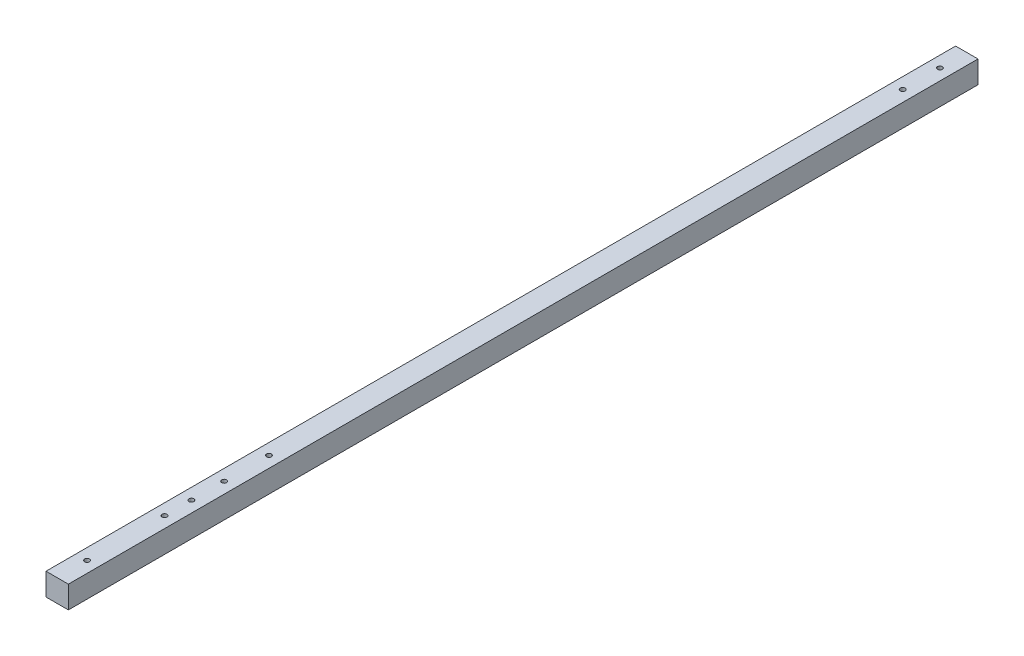
ISO-10303-21;
HEADER;
FILE_DESCRIPTION(('STEP AP214'),'2;1');
FILE_NAME('part.step','',(''),(''),'','','');
FILE_SCHEMA(('AUTOMOTIVE_DESIGN { 1 0 10303 214 1 1 1 1 }'));
ENDSEC;
DATA;
#1=APPLICATION_CONTEXT('core data for automotive mechanical design processes');
#2=APPLICATION_PROTOCOL_DEFINITION('international standard','automotive_design',2000,#1);
#3=PRODUCT_CONTEXT('',#1,'mechanical');
#4=PRODUCT('Part','Part','',(#3));
#5=PRODUCT_RELATED_PRODUCT_CATEGORY('part','',(#4));
#6=PRODUCT_DEFINITION_FORMATION('','',#4);
#7=PRODUCT_DEFINITION_CONTEXT('part definition',#1,'design');
#8=PRODUCT_DEFINITION('design','',#6,#7);
#9=PRODUCT_DEFINITION_SHAPE('','',#8);
#10=(LENGTH_UNIT() NAMED_UNIT(*) SI_UNIT(.MILLI.,.METRE.));
#11=(NAMED_UNIT(*) PLANE_ANGLE_UNIT() SI_UNIT($,.RADIAN.));
#12=(NAMED_UNIT(*) SI_UNIT($,.STERADIAN.) SOLID_ANGLE_UNIT());
#13=UNCERTAINTY_MEASURE_WITH_UNIT(LENGTH_MEASURE(1.E-05),#10,'distance_accuracy_value','');
#14=(GEOMETRIC_REPRESENTATION_CONTEXT(3) GLOBAL_UNCERTAINTY_ASSIGNED_CONTEXT((#13)) GLOBAL_UNIT_ASSIGNED_CONTEXT((#10,
#11,#12)) REPRESENTATION_CONTEXT('',''));
#15=CARTESIAN_POINT('',(0.,0.,0.));
#16=DIRECTION('',(0.,0.,1.));
#17=DIRECTION('',(1.,0.,0.));
#18=AXIS2_PLACEMENT_3D('',#15,#16,#17);
#19=CARTESIAN_POINT('',(7.5,-7.5,610.));
#20=DIRECTION('',(-1.,0.,0.));
#21=DIRECTION('',(0.,0.,1.));
#22=AXIS2_PLACEMENT_3D('',#19,#20,#21);
#23=PLANE('',#22);
#24=DIRECTION('',(0.,1.,0.));
#25=VECTOR('',#24,1.);
#26=CARTESIAN_POINT('',(7.5,-7.5,0.));
#27=LINE('',#26,#25);
#28=CARTESIAN_POINT('',(7.5,-7.5,0.));
#29=VERTEX_POINT('',#28);
#30=CARTESIAN_POINT('',(7.5,7.5,0.));
#31=VERTEX_POINT('',#30);
#32=EDGE_CURVE('E107',#29,#31,#27,.T.);
#33=ORIENTED_EDGE('',*,*,#32,.T.);
#34=DIRECTION('',(0.,0.,-1.));
#35=VECTOR('',#34,1.);
#36=CARTESIAN_POINT('',(7.5,7.5,610.));
#37=LINE('',#36,#35);
#38=CARTESIAN_POINT('',(7.5,7.5,610.));
#39=VERTEX_POINT('',#38);
#40=EDGE_CURVE('E11',#39,#31,#37,.T.);
#41=ORIENTED_EDGE('',*,*,#40,.F.);
#42=DIRECTION('',(0.,1.,0.));
#43=VECTOR('',#42,1.);
#44=CARTESIAN_POINT('',(7.5,-7.5,610.));
#45=LINE('',#44,#43);
#46=CARTESIAN_POINT('',(7.5,-7.5,610.));
#47=VERTEX_POINT('',#46);
#48=EDGE_CURVE('E98',#47,#39,#45,.T.);
#49=ORIENTED_EDGE('',*,*,#48,.F.);
#50=DIRECTION('',(0.,0.,-1.));
#51=VECTOR('',#50,1.);
#52=CARTESIAN_POINT('',(7.5,-7.5,610.));
#53=LINE('',#52,#51);
#54=EDGE_CURVE('E102',#47,#29,#53,.T.);
#55=ORIENTED_EDGE('',*,*,#54,.T.);
#56=EDGE_LOOP('',(#33,#41,#49,#55));
#57=FACE_BOUND('',#56,.T.);
#58=ADVANCED_FACE('F43',(#57),#23,.F.);
#59=CARTESIAN_POINT('',(-7.5,7.5,610.));
#60=DIRECTION('',(0.,-1.,0.));
#61=DIRECTION('',(0.,0.,-1.));
#62=AXIS2_PLACEMENT_3D('',#59,#60,#61);
#63=PLANE('',#62);
#64=CARTESIAN_POINT('',(0.,7.5,590.));
#65=DIRECTION('',(0.,1.,0.));
#66=DIRECTION('',(0.,0.,1.));
#67=AXIS2_PLACEMENT_3D('',#64,#65,#66);
#68=CIRCLE('',#67,1.65);
#69=CARTESIAN_POINT('',(0.,7.5,591.65));
#70=VERTEX_POINT('',#69);
#71=EDGE_CURVE('E122',#70,#70,#68,.T.);
#72=ORIENTED_EDGE('',*,*,#71,.F.);
#73=EDGE_LOOP('',(#72));
#74=FACE_BOUND('',#73,.T.);
#75=CARTESIAN_POINT('',(0.,7.5,468.));
#76=DIRECTION('',(0.,1.,0.));
#77=DIRECTION('',(0.,0.,1.));
#78=AXIS2_PLACEMENT_3D('',#75,#76,#77);
#79=CIRCLE('',#78,1.65);
#80=CARTESIAN_POINT('',(0.,7.5,469.65));
#81=VERTEX_POINT('',#80);
#82=EDGE_CURVE('E272',#81,#81,#79,.T.);
#83=ORIENTED_EDGE('',*,*,#82,.F.);
#84=EDGE_LOOP('',(#83));
#85=FACE_BOUND('',#84,.T.);
#86=CARTESIAN_POINT('',(0.,7.5,538.));
#87=DIRECTION('',(0.,1.,0.));
#88=DIRECTION('',(0.,0.,1.));
#89=AXIS2_PLACEMENT_3D('',#86,#87,#88);
#90=CIRCLE('',#89,1.65);
#91=CARTESIAN_POINT('',(0.,7.5,539.65));
#92=VERTEX_POINT('',#91);
#93=EDGE_CURVE('E251',#92,#92,#90,.T.);
#94=ORIENTED_EDGE('',*,*,#93,.F.);
#95=EDGE_LOOP('',(#94));
#96=FACE_BOUND('',#95,.T.);
#97=CARTESIAN_POINT('',(0.,7.5,520.));
#98=DIRECTION('',(0.,1.,0.));
#99=DIRECTION('',(0.,0.,1.));
#100=AXIS2_PLACEMENT_3D('',#97,#98,#99);
#101=CIRCLE('',#100,1.65);
#102=CARTESIAN_POINT('',(0.,7.5,521.65));
#103=VERTEX_POINT('',#102);
#104=EDGE_CURVE('E284',#103,#103,#101,.T.);
#105=ORIENTED_EDGE('',*,*,#104,.F.);
#106=EDGE_LOOP('',(#105));
#107=FACE_BOUND('',#106,.T.);
#108=CARTESIAN_POINT('',(0.,7.5,18.));
#109=DIRECTION('',(0.,1.,0.));
#110=DIRECTION('',(0.,0.,1.));
#111=AXIS2_PLACEMENT_3D('',#108,#109,#110);
#112=CIRCLE('',#111,1.65);
#113=CARTESIAN_POINT('',(0.,7.5,19.65));
#114=VERTEX_POINT('',#113);
#115=EDGE_CURVE('E282',#114,#114,#112,.T.);
#116=ORIENTED_EDGE('',*,*,#115,.F.);
#117=EDGE_LOOP('',(#116));
#118=FACE_BOUND('',#117,.T.);
#119=CARTESIAN_POINT('',(0.,7.5,43.));
#120=DIRECTION('',(0.,1.,0.));
#121=DIRECTION('',(0.,0.,1.));
#122=AXIS2_PLACEMENT_3D('',#119,#120,#121);
#123=CIRCLE('',#122,1.65);
#124=CARTESIAN_POINT('',(0.,7.5,44.65));
#125=VERTEX_POINT('',#124);
#126=EDGE_CURVE('E274',#125,#125,#123,.T.);
#127=ORIENTED_EDGE('',*,*,#126,.F.);
#128=EDGE_LOOP('',(#127));
#129=FACE_BOUND('',#128,.T.);
#130=CARTESIAN_POINT('',(0.,7.5,498.));
#131=DIRECTION('',(0.,1.,0.));
#132=DIRECTION('',(0.,0.,1.));
#133=AXIS2_PLACEMENT_3D('',#130,#131,#132);
#134=CIRCLE('',#133,1.65);
#135=CARTESIAN_POINT('',(0.,7.5,499.65));
#136=VERTEX_POINT('',#135);
#137=EDGE_CURVE('E269',#136,#136,#134,.T.);
#138=ORIENTED_EDGE('',*,*,#137,.F.);
#139=EDGE_LOOP('',(#138));
#140=FACE_BOUND('',#139,.T.);
#141=DIRECTION('',(-1.,0.,0.));
#142=VECTOR('',#141,1.);
#143=CARTESIAN_POINT('',(-7.5,7.5,0.));
#144=LINE('',#143,#142);
#145=CARTESIAN_POINT('',(-7.5,7.5,0.));
#146=VERTEX_POINT('',#145);
#147=EDGE_CURVE('E99',#31,#146,#144,.T.);
#148=ORIENTED_EDGE('',*,*,#147,.T.);
#149=DIRECTION('',(0.,0.,-1.));
#150=VECTOR('',#149,1.);
#151=CARTESIAN_POINT('',(-7.5,7.5,610.));
#152=LINE('',#151,#150);
#153=CARTESIAN_POINT('',(-7.5,7.5,610.));
#154=VERTEX_POINT('',#153);
#155=EDGE_CURVE('E55',#154,#146,#152,.T.);
#156=ORIENTED_EDGE('',*,*,#155,.F.);
#157=DIRECTION('',(-1.,0.,0.));
#158=VECTOR('',#157,1.);
#159=CARTESIAN_POINT('',(-7.5,7.5,610.));
#160=LINE('',#159,#158);
#161=EDGE_CURVE('E93',#39,#154,#160,.T.);
#162=ORIENTED_EDGE('',*,*,#161,.F.);
#163=ORIENTED_EDGE('',*,*,#40,.T.);
#164=EDGE_LOOP('',(#148,#156,#162,#163));
#165=FACE_BOUND('',#164,.T.);
#166=ADVANCED_FACE('F100',(#74,#85,#96,#107,#118,#129,#140,#165),#63,.F.);
#167=CARTESIAN_POINT('',(-7.5,-7.5,610.));
#168=DIRECTION('',(1.,0.,0.));
#169=DIRECTION('',(0.,0.,-1.));
#170=AXIS2_PLACEMENT_3D('',#167,#168,#169);
#171=PLANE('',#170);
#172=DIRECTION('',(0.,-1.,0.));
#173=VECTOR('',#172,1.);
#174=CARTESIAN_POINT('',(-7.5,-7.5,0.));
#175=LINE('',#174,#173);
#176=CARTESIAN_POINT('',(-7.5,-7.5,0.));
#177=VERTEX_POINT('',#176);
#178=EDGE_CURVE('E76',#146,#177,#175,.T.);
#179=ORIENTED_EDGE('',*,*,#178,.T.);
#180=DIRECTION('',(0.,0.,-1.));
#181=VECTOR('',#180,1.);
#182=CARTESIAN_POINT('',(-7.5,-7.5,610.));
#183=LINE('',#182,#181);
#184=CARTESIAN_POINT('',(-7.5,-7.5,610.));
#185=VERTEX_POINT('',#184);
#186=EDGE_CURVE('E103',#185,#177,#183,.T.);
#187=ORIENTED_EDGE('',*,*,#186,.F.);
#188=DIRECTION('',(0.,-1.,0.));
#189=VECTOR('',#188,1.);
#190=CARTESIAN_POINT('',(-7.5,-7.5,610.));
#191=LINE('',#190,#189);
#192=EDGE_CURVE('E92',#154,#185,#191,.T.);
#193=ORIENTED_EDGE('',*,*,#192,.F.);
#194=ORIENTED_EDGE('',*,*,#155,.T.);
#195=EDGE_LOOP('',(#179,#187,#193,#194));
#196=FACE_BOUND('',#195,.T.);
#197=ADVANCED_FACE('F101',(#196),#171,.F.);
#198=CARTESIAN_POINT('',(-7.5,-7.5,610.));
#199=DIRECTION('',(0.,1.,0.));
#200=DIRECTION('',(0.,0.,1.));
#201=AXIS2_PLACEMENT_3D('',#198,#199,#200);
#202=PLANE('',#201);
#203=CARTESIAN_POINT('',(0.,-7.5,590.));
#204=DIRECTION('',(0.,1.,0.));
#205=DIRECTION('',(0.,0.,1.));
#206=AXIS2_PLACEMENT_3D('',#203,#204,#205);
#207=CIRCLE('',#206,1.65);
#208=CARTESIAN_POINT('',(0.,-7.5,591.65));
#209=VERTEX_POINT('',#208);
#210=EDGE_CURVE('E46',#209,#209,#207,.T.);
#211=ORIENTED_EDGE('',*,*,#210,.T.);
#212=EDGE_LOOP('',(#211));
#213=FACE_BOUND('',#212,.T.);
#214=CARTESIAN_POINT('',(0.,-7.5,468.));
#215=DIRECTION('',(0.,1.,0.));
#216=DIRECTION('',(0.,0.,1.));
#217=AXIS2_PLACEMENT_3D('',#214,#215,#216);
#218=CIRCLE('',#217,1.65);
#219=CARTESIAN_POINT('',(0.,-7.5,469.65));
#220=VERTEX_POINT('',#219);
#221=EDGE_CURVE('E135',#220,#220,#218,.T.);
#222=ORIENTED_EDGE('',*,*,#221,.T.);
#223=EDGE_LOOP('',(#222));
#224=FACE_BOUND('',#223,.T.);
#225=CARTESIAN_POINT('',(0.,-7.5,538.));
#226=DIRECTION('',(0.,1.,0.));
#227=DIRECTION('',(0.,0.,1.));
#228=AXIS2_PLACEMENT_3D('',#225,#226,#227);
#229=CIRCLE('',#228,1.65);
#230=CARTESIAN_POINT('',(0.,-7.5,539.65));
#231=VERTEX_POINT('',#230);
#232=EDGE_CURVE('E128',#231,#231,#229,.T.);
#233=ORIENTED_EDGE('',*,*,#232,.T.);
#234=EDGE_LOOP('',(#233));
#235=FACE_BOUND('',#234,.T.);
#236=CARTESIAN_POINT('',(0.,-7.5,520.));
#237=DIRECTION('',(0.,1.,0.));
#238=DIRECTION('',(0.,0.,1.));
#239=AXIS2_PLACEMENT_3D('',#236,#237,#238);
#240=CIRCLE('',#239,1.65);
#241=CARTESIAN_POINT('',(0.,-7.5,521.65));
#242=VERTEX_POINT('',#241);
#243=EDGE_CURVE('E130',#242,#242,#240,.T.);
#244=ORIENTED_EDGE('',*,*,#243,.T.);
#245=EDGE_LOOP('',(#244));
#246=FACE_BOUND('',#245,.T.);
#247=CARTESIAN_POINT('',(0.,-7.5,18.));
#248=DIRECTION('',(0.,1.,0.));
#249=DIRECTION('',(0.,0.,1.));
#250=AXIS2_PLACEMENT_3D('',#247,#248,#249);
#251=CIRCLE('',#250,1.65);
#252=CARTESIAN_POINT('',(0.,-7.5,19.65));
#253=VERTEX_POINT('',#252);
#254=EDGE_CURVE('E121',#253,#253,#251,.T.);
#255=ORIENTED_EDGE('',*,*,#254,.T.);
#256=EDGE_LOOP('',(#255));
#257=FACE_BOUND('',#256,.T.);
#258=CARTESIAN_POINT('',(0.,-7.5,43.));
#259=DIRECTION('',(0.,1.,0.));
#260=DIRECTION('',(0.,0.,1.));
#261=AXIS2_PLACEMENT_3D('',#258,#259,#260);
#262=CIRCLE('',#261,1.65);
#263=CARTESIAN_POINT('',(0.,-7.5,44.65));
#264=VERTEX_POINT('',#263);
#265=EDGE_CURVE('E119',#264,#264,#262,.T.);
#266=ORIENTED_EDGE('',*,*,#265,.T.);
#267=EDGE_LOOP('',(#266));
#268=FACE_BOUND('',#267,.T.);
#269=CARTESIAN_POINT('',(0.,-7.5,498.));
#270=DIRECTION('',(0.,1.,0.));
#271=DIRECTION('',(0.,0.,1.));
#272=AXIS2_PLACEMENT_3D('',#269,#270,#271);
#273=CIRCLE('',#272,1.65);
#274=CARTESIAN_POINT('',(0.,-7.5,499.65));
#275=VERTEX_POINT('',#274);
#276=EDGE_CURVE('E120',#275,#275,#273,.T.);
#277=ORIENTED_EDGE('',*,*,#276,.T.);
#278=EDGE_LOOP('',(#277));
#279=FACE_BOUND('',#278,.T.);
#280=DIRECTION('',(1.,0.,0.));
#281=VECTOR('',#280,1.);
#282=CARTESIAN_POINT('',(-7.5,-7.5,0.));
#283=LINE('',#282,#281);
#284=EDGE_CURVE('E81',#177,#29,#283,.T.);
#285=ORIENTED_EDGE('',*,*,#284,.T.);
#286=ORIENTED_EDGE('',*,*,#54,.F.);
#287=DIRECTION('',(1.,0.,0.));
#288=VECTOR('',#287,1.);
#289=CARTESIAN_POINT('',(-7.5,-7.5,610.));
#290=LINE('',#289,#288);
#291=EDGE_CURVE('E62',#185,#47,#290,.T.);
#292=ORIENTED_EDGE('',*,*,#291,.F.);
#293=ORIENTED_EDGE('',*,*,#186,.T.);
#294=EDGE_LOOP('',(#285,#286,#292,#293));
#295=FACE_BOUND('',#294,.T.);
#296=ADVANCED_FACE('F137',(#213,#224,#235,#246,#257,#268,#279,#295),#202,.F.);
#297=CARTESIAN_POINT('',(0.,0.,610.));
#298=DIRECTION('',(0.,0.,-1.));
#299=DIRECTION('',(-1.,0.,0.));
#300=AXIS2_PLACEMENT_3D('',#297,#298,#299);
#301=PLANE('',#300);
#302=ORIENTED_EDGE('',*,*,#48,.T.);
#303=ORIENTED_EDGE('',*,*,#161,.T.);
#304=ORIENTED_EDGE('',*,*,#192,.T.);
#305=ORIENTED_EDGE('',*,*,#291,.T.);
#306=EDGE_LOOP('',(#302,#303,#304,#305));
#307=FACE_BOUND('',#306,.T.);
#308=ADVANCED_FACE('F95',(#307),#301,.F.);
#309=CARTESIAN_POINT('',(0.,0.,0.));
#310=DIRECTION('',(0.,0.,-1.));
#311=DIRECTION('',(-1.,0.,0.));
#312=AXIS2_PLACEMENT_3D('',#309,#310,#311);
#313=PLANE('',#312);
#314=ORIENTED_EDGE('',*,*,#32,.F.);
#315=ORIENTED_EDGE('',*,*,#284,.F.);
#316=ORIENTED_EDGE('',*,*,#178,.F.);
#317=ORIENTED_EDGE('',*,*,#147,.F.);
#318=EDGE_LOOP('',(#314,#315,#316,#317));
#319=FACE_BOUND('',#318,.T.);
#320=ADVANCED_FACE('F161',(#319),#313,.T.);
#321=CARTESIAN_POINT('',(0.,-12.5,498.));
#322=DIRECTION('',(0.,1.,0.));
#323=DIRECTION('',(0.,0.,1.));
#324=AXIS2_PLACEMENT_3D('',#321,#322,#323);
#325=CYLINDRICAL_SURFACE('',#324,1.65);
#326=ORIENTED_EDGE('',*,*,#137,.T.);
#327=EDGE_LOOP('',(#326));
#328=FACE_BOUND('',#327,.T.);
#329=ORIENTED_EDGE('',*,*,#276,.F.);
#330=EDGE_LOOP('',(#329));
#331=FACE_BOUND('',#330,.T.);
#332=ADVANCED_FACE('F164',(#328,#331),#325,.F.);
#333=CARTESIAN_POINT('',(0.,-12.5,43.));
#334=DIRECTION('',(0.,1.,0.));
#335=DIRECTION('',(0.,0.,1.));
#336=AXIS2_PLACEMENT_3D('',#333,#334,#335);
#337=CYLINDRICAL_SURFACE('',#336,1.65);
#338=ORIENTED_EDGE('',*,*,#126,.T.);
#339=EDGE_LOOP('',(#338));
#340=FACE_BOUND('',#339,.T.);
#341=ORIENTED_EDGE('',*,*,#265,.F.);
#342=EDGE_LOOP('',(#341));
#343=FACE_BOUND('',#342,.T.);
#344=ADVANCED_FACE('F171',(#340,#343),#337,.F.);
#345=CARTESIAN_POINT('',(0.,-12.5,18.));
#346=DIRECTION('',(0.,1.,0.));
#347=DIRECTION('',(0.,0.,1.));
#348=AXIS2_PLACEMENT_3D('',#345,#346,#347);
#349=CYLINDRICAL_SURFACE('',#348,1.65);
#350=ORIENTED_EDGE('',*,*,#115,.T.);
#351=EDGE_LOOP('',(#350));
#352=FACE_BOUND('',#351,.T.);
#353=ORIENTED_EDGE('',*,*,#254,.F.);
#354=EDGE_LOOP('',(#353));
#355=FACE_BOUND('',#354,.T.);
#356=ADVANCED_FACE('F212',(#352,#355),#349,.F.);
#357=CARTESIAN_POINT('',(0.,-12.5,520.));
#358=DIRECTION('',(0.,1.,0.));
#359=DIRECTION('',(0.,0.,1.));
#360=AXIS2_PLACEMENT_3D('',#357,#358,#359);
#361=CYLINDRICAL_SURFACE('',#360,1.65);
#362=ORIENTED_EDGE('',*,*,#104,.T.);
#363=EDGE_LOOP('',(#362));
#364=FACE_BOUND('',#363,.T.);
#365=ORIENTED_EDGE('',*,*,#243,.F.);
#366=EDGE_LOOP('',(#365));
#367=FACE_BOUND('',#366,.T.);
#368=ADVANCED_FACE('F223',(#364,#367),#361,.F.);
#369=CARTESIAN_POINT('',(0.,-12.5,538.));
#370=DIRECTION('',(0.,1.,0.));
#371=DIRECTION('',(0.,0.,1.));
#372=AXIS2_PLACEMENT_3D('',#369,#370,#371);
#373=CYLINDRICAL_SURFACE('',#372,1.65);
#374=ORIENTED_EDGE('',*,*,#93,.T.);
#375=EDGE_LOOP('',(#374));
#376=FACE_BOUND('',#375,.T.);
#377=ORIENTED_EDGE('',*,*,#232,.F.);
#378=EDGE_LOOP('',(#377));
#379=FACE_BOUND('',#378,.T.);
#380=ADVANCED_FACE('F146',(#376,#379),#373,.F.);
#381=CARTESIAN_POINT('',(0.,-12.5,468.));
#382=DIRECTION('',(0.,1.,0.));
#383=DIRECTION('',(0.,0.,1.));
#384=AXIS2_PLACEMENT_3D('',#381,#382,#383);
#385=CYLINDRICAL_SURFACE('',#384,1.65);
#386=ORIENTED_EDGE('',*,*,#82,.T.);
#387=EDGE_LOOP('',(#386));
#388=FACE_BOUND('',#387,.T.);
#389=ORIENTED_EDGE('',*,*,#221,.F.);
#390=EDGE_LOOP('',(#389));
#391=FACE_BOUND('',#390,.T.);
#392=ADVANCED_FACE('F141',(#388,#391),#385,.F.);
#393=CARTESIAN_POINT('',(0.,-12.5,590.));
#394=DIRECTION('',(0.,1.,0.));
#395=DIRECTION('',(0.,0.,1.));
#396=AXIS2_PLACEMENT_3D('',#393,#394,#395);
#397=CYLINDRICAL_SURFACE('',#396,1.65);
#398=ORIENTED_EDGE('',*,*,#71,.T.);
#399=EDGE_LOOP('',(#398));
#400=FACE_BOUND('',#399,.T.);
#401=ORIENTED_EDGE('',*,*,#210,.F.);
#402=EDGE_LOOP('',(#401));
#403=FACE_BOUND('',#402,.T.);
#404=ADVANCED_FACE('F142',(#400,#403),#397,.F.);
#405=CLOSED_SHELL('',(#58,#166,#197,#296,#308,#320,#332,#344,#356,#368,#380,#392,#404));
#406=MANIFOLD_SOLID_BREP('B2',#405);
#407=ADVANCED_BREP_SHAPE_REPRESENTATION('',(#18,#406),#14);
#408=SHAPE_DEFINITION_REPRESENTATION(#9,#407);
ENDSEC;
END-ISO-10303-21;
